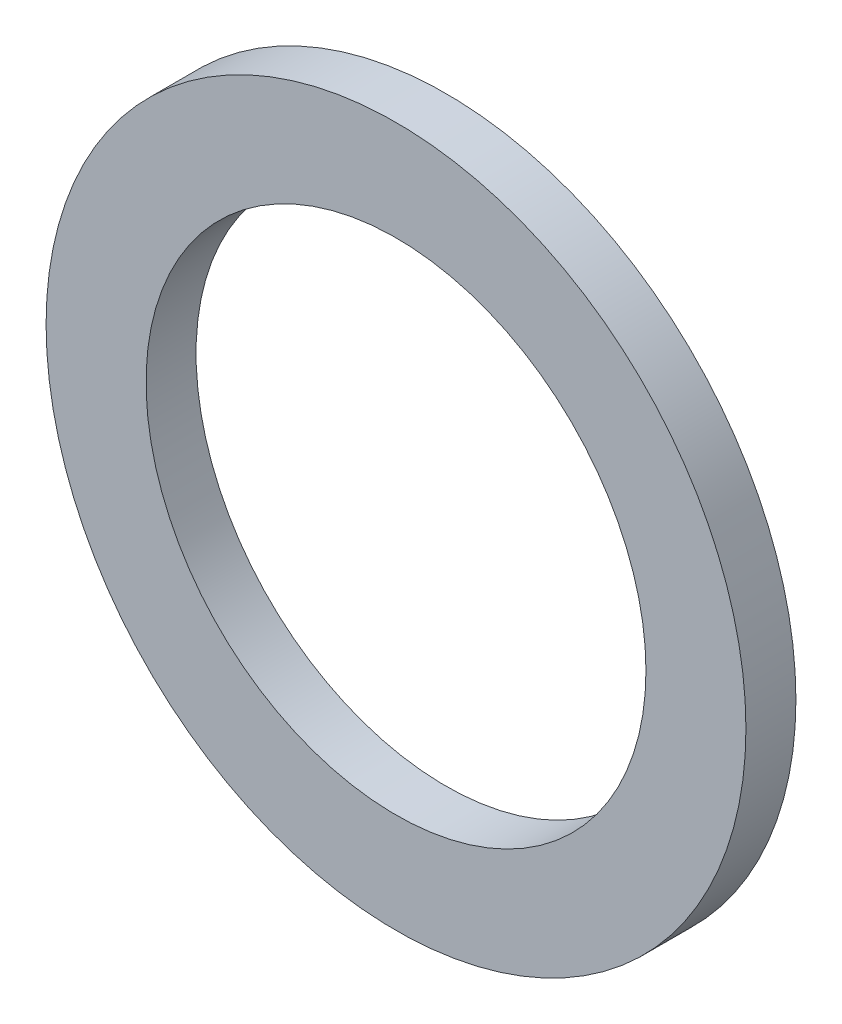
ISO-10303-21;
HEADER;
FILE_DESCRIPTION(('STEP AP214'),'2;1');
FILE_NAME('part.step','',(''),(''),'','','');
FILE_SCHEMA(('AUTOMOTIVE_DESIGN { 1 0 10303 214 1 1 1 1 }'));
ENDSEC;
DATA;
#1=APPLICATION_CONTEXT('core data for automotive mechanical design processes');
#2=APPLICATION_PROTOCOL_DEFINITION('international standard','automotive_design',2000,#1);
#3=PRODUCT_CONTEXT('',#1,'mechanical');
#4=PRODUCT('Part','Part','',(#3));
#5=PRODUCT_RELATED_PRODUCT_CATEGORY('part','',(#4));
#6=PRODUCT_DEFINITION_FORMATION('','',#4);
#7=PRODUCT_DEFINITION_CONTEXT('part definition',#1,'design');
#8=PRODUCT_DEFINITION('design','',#6,#7);
#9=PRODUCT_DEFINITION_SHAPE('','',#8);
#10=(LENGTH_UNIT() NAMED_UNIT(*) SI_UNIT(.MILLI.,.METRE.));
#11=(NAMED_UNIT(*) PLANE_ANGLE_UNIT() SI_UNIT($,.RADIAN.));
#12=(NAMED_UNIT(*) SI_UNIT($,.STERADIAN.) SOLID_ANGLE_UNIT());
#13=UNCERTAINTY_MEASURE_WITH_UNIT(LENGTH_MEASURE(1.E-05),#10,'distance_accuracy_value','');
#14=(GEOMETRIC_REPRESENTATION_CONTEXT(3) GLOBAL_UNCERTAINTY_ASSIGNED_CONTEXT((#13)) GLOBAL_UNIT_ASSIGNED_CONTEXT((#10,
#11,#12)) REPRESENTATION_CONTEXT('',''));
#15=CARTESIAN_POINT('',(0.,0.,0.));
#16=DIRECTION('',(0.,0.,1.));
#17=DIRECTION('',(1.,0.,0.));
#18=AXIS2_PLACEMENT_3D('',#15,#16,#17);
#19=CARTESIAN_POINT('',(0.,0.,0.5));
#20=DIRECTION('',(0.,0.,1.));
#21=DIRECTION('',(1.,0.,0.));
#22=AXIS2_PLACEMENT_3D('',#19,#20,#21);
#23=PLANE('',#22);
#24=CARTESIAN_POINT('',(0.,0.,0.5));
#25=DIRECTION('',(0.,0.,1.));
#26=DIRECTION('',(1.,0.,0.));
#27=AXIS2_PLACEMENT_3D('',#24,#25,#26);
#28=CIRCLE('',#27,3.5);
#29=CARTESIAN_POINT('',(3.5,0.,0.5));
#30=VERTEX_POINT('',#29);
#31=EDGE_CURVE('E10',#30,#30,#28,.T.);
#32=ORIENTED_EDGE('',*,*,#31,.T.);
#33=EDGE_LOOP('',(#32));
#34=FACE_BOUND('',#33,.T.);
#35=CARTESIAN_POINT('',(0.,0.,0.5));
#36=DIRECTION('',(0.,0.,1.));
#37=DIRECTION('',(1.,0.,0.));
#38=AXIS2_PLACEMENT_3D('',#35,#36,#37);
#39=CIRCLE('',#38,2.5);
#40=CARTESIAN_POINT('',(2.5,0.,0.5));
#41=VERTEX_POINT('',#40);
#42=EDGE_CURVE('E54',#41,#41,#39,.T.);
#43=ORIENTED_EDGE('',*,*,#42,.F.);
#44=EDGE_LOOP('',(#43));
#45=FACE_BOUND('',#44,.T.);
#46=ADVANCED_FACE('F41',(#34,#45),#23,.T.);
#47=CARTESIAN_POINT('',(0.,0.,0.));
#48=DIRECTION('',(0.,0.,1.));
#49=DIRECTION('',(1.,0.,0.));
#50=AXIS2_PLACEMENT_3D('',#47,#48,#49);
#51=PLANE('',#50);
#52=CARTESIAN_POINT('',(0.,0.,0.));
#53=DIRECTION('',(0.,0.,1.));
#54=DIRECTION('',(1.,0.,0.));
#55=AXIS2_PLACEMENT_3D('',#52,#53,#54);
#56=CIRCLE('',#55,3.5);
#57=CARTESIAN_POINT('',(3.5,0.,0.));
#58=VERTEX_POINT('',#57);
#59=EDGE_CURVE('E45',#58,#58,#56,.T.);
#60=ORIENTED_EDGE('',*,*,#59,.F.);
#61=EDGE_LOOP('',(#60));
#62=FACE_BOUND('',#61,.T.);
#63=CARTESIAN_POINT('',(0.,0.,0.));
#64=DIRECTION('',(0.,0.,1.));
#65=DIRECTION('',(1.,0.,0.));
#66=AXIS2_PLACEMENT_3D('',#63,#64,#65);
#67=CIRCLE('',#66,2.5);
#68=CARTESIAN_POINT('',(2.5,0.,0.));
#69=VERTEX_POINT('',#68);
#70=EDGE_CURVE('E56',#69,#69,#67,.T.);
#71=ORIENTED_EDGE('',*,*,#70,.T.);
#72=EDGE_LOOP('',(#71));
#73=FACE_BOUND('',#72,.T.);
#74=ADVANCED_FACE('F68',(#62,#73),#51,.F.);
#75=CARTESIAN_POINT('',(0.,0.,0.5));
#76=DIRECTION('',(0.,0.,-1.));
#77=DIRECTION('',(-1.,0.,0.));
#78=AXIS2_PLACEMENT_3D('',#75,#76,#77);
#79=CYLINDRICAL_SURFACE('',#78,3.5);
#80=ORIENTED_EDGE('',*,*,#31,.F.);
#81=EDGE_LOOP('',(#80));
#82=FACE_BOUND('',#81,.T.);
#83=ORIENTED_EDGE('',*,*,#59,.T.);
#84=EDGE_LOOP('',(#83));
#85=FACE_BOUND('',#84,.T.);
#86=ADVANCED_FACE('F43',(#82,#85),#79,.T.);
#87=CARTESIAN_POINT('',(0.,0.,0.5));
#88=DIRECTION('',(0.,0.,-1.));
#89=DIRECTION('',(-1.,0.,0.));
#90=AXIS2_PLACEMENT_3D('',#87,#88,#89);
#91=CYLINDRICAL_SURFACE('',#90,2.5);
#92=ORIENTED_EDGE('',*,*,#42,.T.);
#93=EDGE_LOOP('',(#92));
#94=FACE_BOUND('',#93,.T.);
#95=ORIENTED_EDGE('',*,*,#70,.F.);
#96=EDGE_LOOP('',(#95));
#97=FACE_BOUND('',#96,.T.);
#98=ADVANCED_FACE('F64',(#94,#97),#91,.F.);
#99=CLOSED_SHELL('',(#46,#74,#86,#98));
#100=MANIFOLD_SOLID_BREP('B2',#99);
#101=ADVANCED_BREP_SHAPE_REPRESENTATION('',(#18,#100),#14);
#102=SHAPE_DEFINITION_REPRESENTATION(#9,#101);
ENDSEC;
END-ISO-10303-21;
